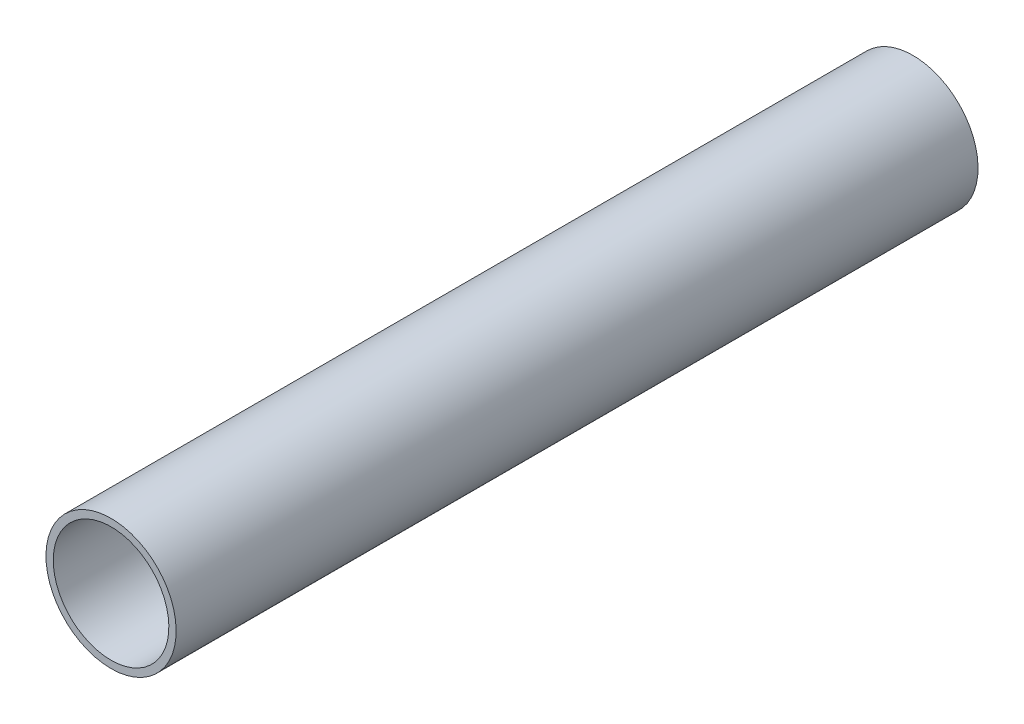
ISO-10303-21;
HEADER;
FILE_DESCRIPTION(('STEP AP214'),'2;1');
FILE_NAME('part.step','',(''),(''),'','','');
FILE_SCHEMA(('AUTOMOTIVE_DESIGN { 1 0 10303 214 1 1 1 1 }'));
ENDSEC;
DATA;
#1=APPLICATION_CONTEXT('core data for automotive mechanical design processes');
#2=APPLICATION_PROTOCOL_DEFINITION('international standard','automotive_design',2000,#1);
#3=PRODUCT_CONTEXT('',#1,'mechanical');
#4=PRODUCT('Part','Part','',(#3));
#5=PRODUCT_RELATED_PRODUCT_CATEGORY('part','',(#4));
#6=PRODUCT_DEFINITION_FORMATION('','',#4);
#7=PRODUCT_DEFINITION_CONTEXT('part definition',#1,'design');
#8=PRODUCT_DEFINITION('design','',#6,#7);
#9=PRODUCT_DEFINITION_SHAPE('','',#8);
#10=(LENGTH_UNIT() NAMED_UNIT(*) SI_UNIT(.MILLI.,.METRE.));
#11=(NAMED_UNIT(*) PLANE_ANGLE_UNIT() SI_UNIT($,.RADIAN.));
#12=(NAMED_UNIT(*) SI_UNIT($,.STERADIAN.) SOLID_ANGLE_UNIT());
#13=UNCERTAINTY_MEASURE_WITH_UNIT(LENGTH_MEASURE(1.E-05),#10,'distance_accuracy_value','');
#14=(GEOMETRIC_REPRESENTATION_CONTEXT(3) GLOBAL_UNCERTAINTY_ASSIGNED_CONTEXT((#13)) GLOBAL_UNIT_ASSIGNED_CONTEXT((#10,
#11,#12)) REPRESENTATION_CONTEXT('',''));
#15=CARTESIAN_POINT('',(0.,0.,0.));
#16=DIRECTION('',(0.,0.,1.));
#17=DIRECTION('',(1.,0.,0.));
#18=AXIS2_PLACEMENT_3D('',#15,#16,#17);
#19=CARTESIAN_POINT('',(0.,0.,39.116));
#20=DIRECTION('',(0.,0.,1.));
#21=DIRECTION('',(0.,-1.,0.));
#22=AXIS2_PLACEMENT_3D('',#19,#20,#21);
#23=CYLINDRICAL_SURFACE('',#22,2.8194);
#24=CARTESIAN_POINT('',(0.,0.,0.));
#25=DIRECTION('',(0.,0.,1.));
#26=DIRECTION('',(0.,-1.,0.));
#27=AXIS2_PLACEMENT_3D('',#24,#25,#26);
#28=CIRCLE('',#27,2.8194);
#29=CARTESIAN_POINT('',(0.,-2.81939999999999,0.));
#30=VERTEX_POINT('',#29);
#31=EDGE_CURVE('E27',#30,#30,#28,.F.);
#32=ORIENTED_EDGE('',*,*,#31,.T.);
#33=EDGE_LOOP('',(#32));
#34=FACE_BOUND('',#33,.T.);
#35=CARTESIAN_POINT('',(0.,0.,39.116));
#36=DIRECTION('',(0.,0.,1.));
#37=DIRECTION('',(0.,-1.,0.));
#38=AXIS2_PLACEMENT_3D('',#35,#36,#37);
#39=CIRCLE('',#38,2.8194);
#40=CARTESIAN_POINT('',(0.,-2.81939999999999,39.116));
#41=VERTEX_POINT('',#40);
#42=EDGE_CURVE('E18',#41,#41,#39,.F.);
#43=ORIENTED_EDGE('',*,*,#42,.F.);
#44=EDGE_LOOP('',(#43));
#45=FACE_BOUND('',#44,.T.);
#46=ADVANCED_FACE('F15',(#34,#45),#23,.F.);
#47=CARTESIAN_POINT('',(0.,0.,39.116));
#48=DIRECTION('',(0.,0.,1.));
#49=DIRECTION('',(0.,-1.,0.));
#50=AXIS2_PLACEMENT_3D('',#47,#48,#49);
#51=PLANE('',#50);
#52=ORIENTED_EDGE('',*,*,#42,.T.);
#53=EDGE_LOOP('',(#52));
#54=FACE_BOUND('',#53,.T.);
#55=CARTESIAN_POINT('',(0.,0.,39.116));
#56=DIRECTION('',(0.,0.,1.));
#57=DIRECTION('',(0.,-1.,0.));
#58=AXIS2_PLACEMENT_3D('',#55,#56,#57);
#59=CIRCLE('',#58,3.175);
#60=CARTESIAN_POINT('',(0.,-3.17499999999999,39.116));
#61=VERTEX_POINT('',#60);
#62=EDGE_CURVE('E22',#61,#61,#59,.F.);
#63=ORIENTED_EDGE('',*,*,#62,.F.);
#64=EDGE_LOOP('',(#63));
#65=FACE_BOUND('',#64,.T.);
#66=ADVANCED_FACE('F35',(#54,#65),#51,.T.);
#67=CARTESIAN_POINT('',(0.,0.,0.));
#68=DIRECTION('',(0.,0.,1.));
#69=DIRECTION('',(0.,-1.,0.));
#70=AXIS2_PLACEMENT_3D('',#67,#68,#69);
#71=PLANE('',#70);
#72=ORIENTED_EDGE('',*,*,#31,.F.);
#73=EDGE_LOOP('',(#72));
#74=FACE_BOUND('',#73,.T.);
#75=CARTESIAN_POINT('',(0.,0.,0.));
#76=DIRECTION('',(0.,0.,1.));
#77=DIRECTION('',(0.,-1.,0.));
#78=AXIS2_PLACEMENT_3D('',#75,#76,#77);
#79=CIRCLE('',#78,3.175);
#80=CARTESIAN_POINT('',(0.,-3.17499999999999,0.));
#81=VERTEX_POINT('',#80);
#82=EDGE_CURVE('E10',#81,#81,#79,.T.);
#83=ORIENTED_EDGE('',*,*,#82,.F.);
#84=EDGE_LOOP('',(#83));
#85=FACE_BOUND('',#84,.T.);
#86=ADVANCED_FACE('F43',(#74,#85),#71,.F.);
#87=CARTESIAN_POINT('',(0.,0.,39.116));
#88=DIRECTION('',(0.,0.,1.));
#89=DIRECTION('',(0.,-1.,0.));
#90=AXIS2_PLACEMENT_3D('',#87,#88,#89);
#91=CYLINDRICAL_SURFACE('',#90,3.175);
#92=ORIENTED_EDGE('',*,*,#82,.T.);
#93=EDGE_LOOP('',(#92));
#94=FACE_BOUND('',#93,.T.);
#95=ORIENTED_EDGE('',*,*,#62,.T.);
#96=EDGE_LOOP('',(#95));
#97=FACE_BOUND('',#96,.T.);
#98=ADVANCED_FACE('F44',(#94,#97),#91,.T.);
#99=CLOSED_SHELL('',(#46,#66,#86,#98));
#100=MANIFOLD_SOLID_BREP('B1',#99);
#101=ADVANCED_BREP_SHAPE_REPRESENTATION('',(#18,#100),#14);
#102=SHAPE_DEFINITION_REPRESENTATION(#9,#101);
ENDSEC;
END-ISO-10303-21;
